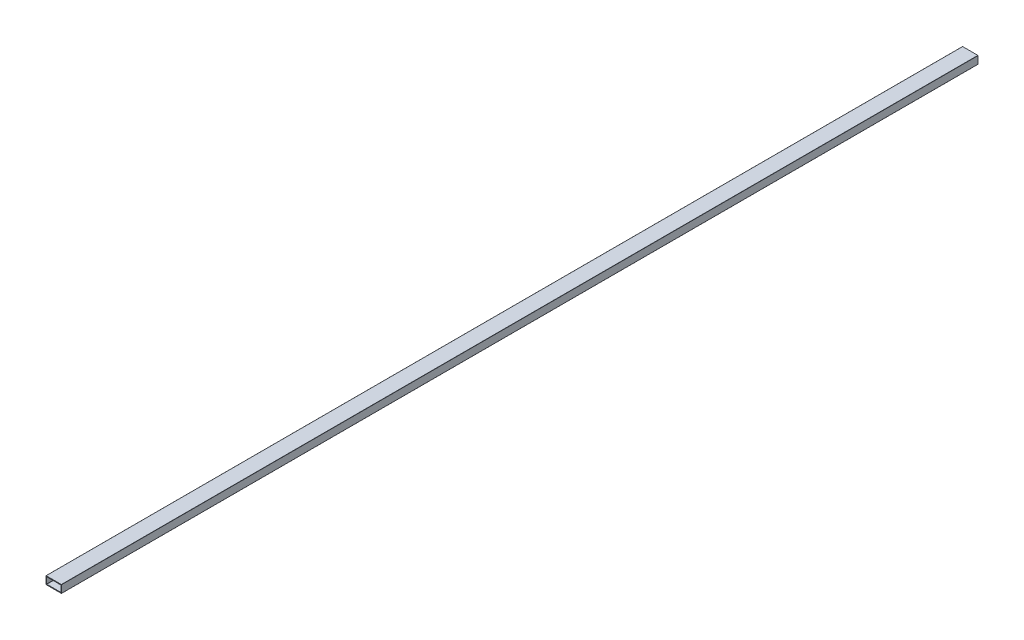
ISO-10303-21;
HEADER;
FILE_DESCRIPTION(('STEP AP214'),'2;1');
FILE_NAME('part.step','',(''),(''),'','','');
FILE_SCHEMA(('AUTOMOTIVE_DESIGN { 1 0 10303 214 1 1 1 1 }'));
ENDSEC;
DATA;
#1=APPLICATION_CONTEXT('core data for automotive mechanical design processes');
#2=APPLICATION_PROTOCOL_DEFINITION('international standard','automotive_design',2000,#1);
#3=PRODUCT_CONTEXT('',#1,'mechanical');
#4=PRODUCT('Part','Part','',(#3));
#5=PRODUCT_RELATED_PRODUCT_CATEGORY('part','',(#4));
#6=PRODUCT_DEFINITION_FORMATION('','',#4);
#7=PRODUCT_DEFINITION_CONTEXT('part definition',#1,'design');
#8=PRODUCT_DEFINITION('design','',#6,#7);
#9=PRODUCT_DEFINITION_SHAPE('','',#8);
#10=(LENGTH_UNIT() NAMED_UNIT(*) SI_UNIT(.MILLI.,.METRE.));
#11=(NAMED_UNIT(*) PLANE_ANGLE_UNIT() SI_UNIT($,.RADIAN.));
#12=(NAMED_UNIT(*) SI_UNIT($,.STERADIAN.) SOLID_ANGLE_UNIT());
#13=UNCERTAINTY_MEASURE_WITH_UNIT(LENGTH_MEASURE(1.E-05),#10,'distance_accuracy_value','');
#14=(GEOMETRIC_REPRESENTATION_CONTEXT(3) GLOBAL_UNCERTAINTY_ASSIGNED_CONTEXT((#13)) GLOBAL_UNIT_ASSIGNED_CONTEXT((#10,
#11,#12)) REPRESENTATION_CONTEXT('',''));
#15=CARTESIAN_POINT('',(0.,0.,0.));
#16=DIRECTION('',(0.,0.,1.));
#17=DIRECTION('',(1.,0.,0.));
#18=AXIS2_PLACEMENT_3D('',#15,#16,#17);
#19=CARTESIAN_POINT('',(50.8,-25.4,-6000.));
#20=DIRECTION('',(1.,0.,0.));
#21=DIRECTION('',(0.,0.,-1.));
#22=AXIS2_PLACEMENT_3D('',#19,#20,#21);
#23=PLANE('',#22);
#24=DIRECTION('',(0.,1.,0.));
#25=VECTOR('',#24,1.);
#26=CARTESIAN_POINT('',(50.8,-25.4,0.));
#27=LINE('',#26,#25);
#28=CARTESIAN_POINT('',(50.8,-24.4,0.));
#29=VERTEX_POINT('',#28);
#30=CARTESIAN_POINT('',(50.8,24.4,0.));
#31=VERTEX_POINT('',#30);
#32=EDGE_CURVE('E197',#29,#31,#27,.T.);
#33=ORIENTED_EDGE('',*,*,#32,.F.);
#34=DIRECTION('',(0.,0.,1.));
#35=VECTOR('',#34,1.);
#36=CARTESIAN_POINT('',(50.8,-24.4,-6000.));
#37=LINE('',#36,#35);
#38=CARTESIAN_POINT('',(50.8,-24.4,-6000.));
#39=VERTEX_POINT('',#38);
#40=EDGE_CURVE('E158',#29,#39,#37,.F.);
#41=ORIENTED_EDGE('',*,*,#40,.T.);
#42=DIRECTION('',(0.,1.,0.));
#43=VECTOR('',#42,1.);
#44=CARTESIAN_POINT('',(50.8,-25.4,-6000.));
#45=LINE('',#44,#43);
#46=CARTESIAN_POINT('',(50.8,24.4,-6000.));
#47=VERTEX_POINT('',#46);
#48=EDGE_CURVE('E185',#39,#47,#45,.T.);
#49=ORIENTED_EDGE('',*,*,#48,.T.);
#50=DIRECTION('',(0.,0.,1.));
#51=VECTOR('',#50,1.);
#52=CARTESIAN_POINT('',(50.8,24.4,-6000.));
#53=LINE('',#52,#51);
#54=EDGE_CURVE('E251',#47,#31,#53,.T.);
#55=ORIENTED_EDGE('',*,*,#54,.T.);
#56=EDGE_LOOP('',(#33,#41,#49,#55));
#57=FACE_BOUND('',#56,.T.);
#58=ADVANCED_FACE('F33',(#57),#23,.T.);
#59=CARTESIAN_POINT('',(-50.8,-25.4,-6000.));
#60=DIRECTION('',(0.,-1.,0.));
#61=DIRECTION('',(0.,0.,-1.));
#62=AXIS2_PLACEMENT_3D('',#59,#60,#61);
#63=PLANE('',#62);
#64=DIRECTION('',(1.,0.,0.));
#65=VECTOR('',#64,1.);
#66=CARTESIAN_POINT('',(-50.8,-25.4,0.));
#67=LINE('',#66,#65);
#68=CARTESIAN_POINT('',(-49.8,-25.4,0.));
#69=VERTEX_POINT('',#68);
#70=CARTESIAN_POINT('',(49.8,-25.4,0.));
#71=VERTEX_POINT('',#70);
#72=EDGE_CURVE('E189',#69,#71,#67,.T.);
#73=ORIENTED_EDGE('',*,*,#72,.F.);
#74=DIRECTION('',(0.,0.,1.));
#75=VECTOR('',#74,1.);
#76=CARTESIAN_POINT('',(-49.8,-25.4,-6000.));
#77=LINE('',#76,#75);
#78=CARTESIAN_POINT('',(-49.8,-25.4,-6000.));
#79=VERTEX_POINT('',#78);
#80=EDGE_CURVE('E238',#69,#79,#77,.F.);
#81=ORIENTED_EDGE('',*,*,#80,.T.);
#82=DIRECTION('',(1.,0.,0.));
#83=VECTOR('',#82,1.);
#84=CARTESIAN_POINT('',(-50.8,-25.4,-6000.));
#85=LINE('',#84,#83);
#86=CARTESIAN_POINT('',(49.8,-25.4,-6000.));
#87=VERTEX_POINT('',#86);
#88=EDGE_CURVE('E194',#79,#87,#85,.T.);
#89=ORIENTED_EDGE('',*,*,#88,.T.);
#90=DIRECTION('',(0.,0.,1.));
#91=VECTOR('',#90,1.);
#92=CARTESIAN_POINT('',(49.8,-25.4,-6000.));
#93=LINE('',#92,#91);
#94=EDGE_CURVE('E235',#87,#71,#93,.T.);
#95=ORIENTED_EDGE('',*,*,#94,.T.);
#96=EDGE_LOOP('',(#73,#81,#89,#95));
#97=FACE_BOUND('',#96,.T.);
#98=ADVANCED_FACE('F305',(#97),#63,.T.);
#99=CARTESIAN_POINT('',(-50.8,-25.4,-6000.));
#100=DIRECTION('',(-1.,0.,0.));
#101=DIRECTION('',(0.,0.,1.));
#102=AXIS2_PLACEMENT_3D('',#99,#100,#101);
#103=PLANE('',#102);
#104=DIRECTION('',(0.,-1.,0.));
#105=VECTOR('',#104,1.);
#106=CARTESIAN_POINT('',(-50.8,-25.4,-6000.));
#107=LINE('',#106,#105);
#108=CARTESIAN_POINT('',(-50.8,24.4,-6000.));
#109=VERTEX_POINT('',#108);
#110=CARTESIAN_POINT('',(-50.8,-24.4,-6000.));
#111=VERTEX_POINT('',#110);
#112=EDGE_CURVE('E191',#109,#111,#107,.T.);
#113=ORIENTED_EDGE('',*,*,#112,.T.);
#114=DIRECTION('',(0.,0.,1.));
#115=VECTOR('',#114,1.);
#116=CARTESIAN_POINT('',(-50.8,-24.4,-6000.));
#117=LINE('',#116,#115);
#118=CARTESIAN_POINT('',(-50.8,-24.4,0.));
#119=VERTEX_POINT('',#118);
#120=EDGE_CURVE('E224',#111,#119,#117,.T.);
#121=ORIENTED_EDGE('',*,*,#120,.T.);
#122=DIRECTION('',(0.,-1.,0.));
#123=VECTOR('',#122,1.);
#124=CARTESIAN_POINT('',(-50.8,-25.4,0.));
#125=LINE('',#124,#123);
#126=CARTESIAN_POINT('',(-50.8,24.4,0.));
#127=VERTEX_POINT('',#126);
#128=EDGE_CURVE('E203',#127,#119,#125,.T.);
#129=ORIENTED_EDGE('',*,*,#128,.F.);
#130=DIRECTION('',(0.,0.,1.));
#131=VECTOR('',#130,1.);
#132=CARTESIAN_POINT('',(-50.8,24.4,-6000.));
#133=LINE('',#132,#131);
#134=EDGE_CURVE('E222',#127,#109,#133,.F.);
#135=ORIENTED_EDGE('',*,*,#134,.T.);
#136=EDGE_LOOP('',(#113,#121,#129,#135));
#137=FACE_BOUND('',#136,.T.);
#138=ADVANCED_FACE('F311',(#137),#103,.T.);
#139=CARTESIAN_POINT('',(-50.8,25.4,-6000.));
#140=DIRECTION('',(0.,1.,0.));
#141=DIRECTION('',(0.,0.,1.));
#142=AXIS2_PLACEMENT_3D('',#139,#140,#141);
#143=PLANE('',#142);
#144=DIRECTION('',(-1.,0.,0.));
#145=VECTOR('',#144,1.);
#146=CARTESIAN_POINT('',(-50.8,25.4,-6000.));
#147=LINE('',#146,#145);
#148=CARTESIAN_POINT('',(49.8,25.4,-6000.));
#149=VERTEX_POINT('',#148);
#150=CARTESIAN_POINT('',(-49.8,25.4,-6000.));
#151=VERTEX_POINT('',#150);
#152=EDGE_CURVE('E188',#149,#151,#147,.T.);
#153=ORIENTED_EDGE('',*,*,#152,.T.);
#154=DIRECTION('',(0.,0.,1.));
#155=VECTOR('',#154,1.);
#156=CARTESIAN_POINT('',(-49.8,25.4,-6000.));
#157=LINE('',#156,#155);
#158=CARTESIAN_POINT('',(-49.8,25.4,0.));
#159=VERTEX_POINT('',#158);
#160=EDGE_CURVE('E248',#151,#159,#157,.T.);
#161=ORIENTED_EDGE('',*,*,#160,.T.);
#162=DIRECTION('',(-1.,0.,0.));
#163=VECTOR('',#162,1.);
#164=CARTESIAN_POINT('',(-50.8,25.4,0.));
#165=LINE('',#164,#163);
#166=CARTESIAN_POINT('',(49.8,25.4,0.));
#167=VERTEX_POINT('',#166);
#168=EDGE_CURVE('E200',#167,#159,#165,.T.);
#169=ORIENTED_EDGE('',*,*,#168,.F.);
#170=DIRECTION('',(0.,0.,1.));
#171=VECTOR('',#170,1.);
#172=CARTESIAN_POINT('',(49.8,25.4,-6000.));
#173=LINE('',#172,#171);
#174=EDGE_CURVE('E55',#167,#149,#173,.F.);
#175=ORIENTED_EDGE('',*,*,#174,.T.);
#176=EDGE_LOOP('',(#153,#161,#169,#175));
#177=FACE_BOUND('',#176,.T.);
#178=ADVANCED_FACE('F316',(#177),#143,.T.);
#179=CARTESIAN_POINT('',(0.,0.,-6000.));
#180=DIRECTION('',(0.,0.,-1.));
#181=DIRECTION('',(-1.,0.,0.));
#182=AXIS2_PLACEMENT_3D('',#179,#180,#181);
#183=PLANE('',#182);
#184=DIRECTION('',(0.,-1.,0.));
#185=VECTOR('',#184,1.);
#186=CARTESIAN_POINT('',(-46.25,-20.85,-6000.));
#187=LINE('',#186,#185);
#188=CARTESIAN_POINT('',(-46.25,19.85,-6000.));
#189=VERTEX_POINT('',#188);
#190=CARTESIAN_POINT('',(-46.25,-19.85,-6000.));
#191=VERTEX_POINT('',#190);
#192=EDGE_CURVE('E167',#189,#191,#187,.T.);
#193=ORIENTED_EDGE('',*,*,#192,.T.);
#194=CARTESIAN_POINT('',(-45.25,-19.85,-6000.));
#195=DIRECTION('',(0.,0.,-1.));
#196=DIRECTION('',(-1.,0.,0.));
#197=AXIS2_PLACEMENT_3D('',#194,#195,#196);
#198=CIRCLE('',#197,1.);
#199=CARTESIAN_POINT('',(-45.25,-20.85,-6000.));
#200=VERTEX_POINT('',#199);
#201=EDGE_CURVE('E11',#191,#200,#198,.F.);
#202=ORIENTED_EDGE('',*,*,#201,.T.);
#203=DIRECTION('',(1.,0.,0.));
#204=VECTOR('',#203,1.);
#205=CARTESIAN_POINT('',(-46.25,-20.85,-6000.));
#206=LINE('',#205,#204);
#207=CARTESIAN_POINT('',(45.25,-20.85,-6000.));
#208=VERTEX_POINT('',#207);
#209=EDGE_CURVE('E175',#200,#208,#206,.T.);
#210=ORIENTED_EDGE('',*,*,#209,.T.);
#211=CARTESIAN_POINT('',(45.25,-19.85,-6000.));
#212=DIRECTION('',(0.,0.,-1.));
#213=DIRECTION('',(-1.,0.,0.));
#214=AXIS2_PLACEMENT_3D('',#211,#212,#213);
#215=CIRCLE('',#214,1.);
#216=CARTESIAN_POINT('',(46.25,-19.85,-6000.));
#217=VERTEX_POINT('',#216);
#218=EDGE_CURVE('E262',#208,#217,#215,.F.);
#219=ORIENTED_EDGE('',*,*,#218,.T.);
#220=DIRECTION('',(0.,1.,0.));
#221=VECTOR('',#220,1.);
#222=CARTESIAN_POINT('',(46.25,-20.85,-6000.));
#223=LINE('',#222,#221);
#224=CARTESIAN_POINT('',(46.25,19.85,-6000.));
#225=VERTEX_POINT('',#224);
#226=EDGE_CURVE('E179',#217,#225,#223,.T.);
#227=ORIENTED_EDGE('',*,*,#226,.T.);
#228=CARTESIAN_POINT('',(45.25,19.85,-6000.));
#229=DIRECTION('',(0.,0.,-1.));
#230=DIRECTION('',(-1.,0.,0.));
#231=AXIS2_PLACEMENT_3D('',#228,#229,#230);
#232=CIRCLE('',#231,1.);
#233=CARTESIAN_POINT('',(45.25,20.85,-6000.));
#234=VERTEX_POINT('',#233);
#235=EDGE_CURVE('E258',#225,#234,#232,.F.);
#236=ORIENTED_EDGE('',*,*,#235,.T.);
#237=DIRECTION('',(-1.,0.,0.));
#238=VECTOR('',#237,1.);
#239=CARTESIAN_POINT('',(-46.25,20.85,-6000.));
#240=LINE('',#239,#238);
#241=CARTESIAN_POINT('',(-45.25,20.85,-6000.));
#242=VERTEX_POINT('',#241);
#243=EDGE_CURVE('E277',#234,#242,#240,.T.);
#244=ORIENTED_EDGE('',*,*,#243,.T.);
#245=CARTESIAN_POINT('',(-45.25,19.85,-6000.));
#246=DIRECTION('',(0.,0.,-1.));
#247=DIRECTION('',(-1.,0.,0.));
#248=AXIS2_PLACEMENT_3D('',#245,#246,#247);
#249=CIRCLE('',#248,1.);
#250=EDGE_CURVE('E157',#242,#189,#249,.F.);
#251=ORIENTED_EDGE('',*,*,#250,.T.);
#252=EDGE_LOOP('',(#193,#202,#210,#219,#227,#236,#244,#251));
#253=FACE_BOUND('',#252,.T.);
#254=ORIENTED_EDGE('',*,*,#88,.F.);
#255=CARTESIAN_POINT('',(-49.8,-24.4,-6000.));
#256=DIRECTION('',(0.,0.,-1.));
#257=DIRECTION('',(-1.,0.,0.));
#258=AXIS2_PLACEMENT_3D('',#255,#256,#257);
#259=CIRCLE('',#258,1.);
#260=EDGE_CURVE('E245',#79,#111,#259,.T.);
#261=ORIENTED_EDGE('',*,*,#260,.T.);
#262=ORIENTED_EDGE('',*,*,#112,.F.);
#263=CARTESIAN_POINT('',(-49.8,24.4,-6000.));
#264=DIRECTION('',(0.,0.,-1.));
#265=DIRECTION('',(-1.,0.,0.));
#266=AXIS2_PLACEMENT_3D('',#263,#264,#265);
#267=CIRCLE('',#266,1.);
#268=EDGE_CURVE('E48',#109,#151,#267,.T.);
#269=ORIENTED_EDGE('',*,*,#268,.T.);
#270=ORIENTED_EDGE('',*,*,#152,.F.);
#271=CARTESIAN_POINT('',(49.8,24.4,-6000.));
#272=DIRECTION('',(0.,0.,-1.));
#273=DIRECTION('',(-1.,0.,0.));
#274=AXIS2_PLACEMENT_3D('',#271,#272,#273);
#275=CIRCLE('',#274,1.);
#276=EDGE_CURVE('E240',#149,#47,#275,.T.);
#277=ORIENTED_EDGE('',*,*,#276,.T.);
#278=ORIENTED_EDGE('',*,*,#48,.F.);
#279=CARTESIAN_POINT('',(49.8,-24.4,-6000.));
#280=DIRECTION('',(0.,0.,-1.));
#281=DIRECTION('',(-1.,0.,0.));
#282=AXIS2_PLACEMENT_3D('',#279,#280,#281);
#283=CIRCLE('',#282,1.);
#284=EDGE_CURVE('E242',#39,#87,#283,.T.);
#285=ORIENTED_EDGE('',*,*,#284,.T.);
#286=EDGE_LOOP('',(#254,#261,#262,#269,#270,#277,#278,#285));
#287=FACE_BOUND('',#286,.T.);
#288=ADVANCED_FACE('F267',(#253,#287),#183,.T.);
#289=CARTESIAN_POINT('',(0.,0.,0.));
#290=DIRECTION('',(0.,0.,-1.));
#291=DIRECTION('',(-1.,0.,0.));
#292=AXIS2_PLACEMENT_3D('',#289,#290,#291);
#293=PLANE('',#292);
#294=DIRECTION('',(0.,1.,0.));
#295=VECTOR('',#294,1.);
#296=CARTESIAN_POINT('',(46.25,-20.85,0.));
#297=LINE('',#296,#295);
#298=CARTESIAN_POINT('',(46.25,-19.85,0.));
#299=VERTEX_POINT('',#298);
#300=CARTESIAN_POINT('',(46.25,19.85,0.));
#301=VERTEX_POINT('',#300);
#302=EDGE_CURVE('E181',#299,#301,#297,.T.);
#303=ORIENTED_EDGE('',*,*,#302,.F.);
#304=CARTESIAN_POINT('',(45.25,-19.85,0.));
#305=DIRECTION('',(0.,0.,-1.));
#306=DIRECTION('',(-1.,0.,0.));
#307=AXIS2_PLACEMENT_3D('',#304,#305,#306);
#308=CIRCLE('',#307,1.);
#309=CARTESIAN_POINT('',(45.25,-20.85,0.));
#310=VERTEX_POINT('',#309);
#311=EDGE_CURVE('E260',#299,#310,#308,.T.);
#312=ORIENTED_EDGE('',*,*,#311,.T.);
#313=DIRECTION('',(1.,0.,0.));
#314=VECTOR('',#313,1.);
#315=CARTESIAN_POINT('',(-46.25,-20.85,0.));
#316=LINE('',#315,#314);
#317=CARTESIAN_POINT('',(-45.25,-20.85,0.));
#318=VERTEX_POINT('',#317);
#319=EDGE_CURVE('E281',#318,#310,#316,.T.);
#320=ORIENTED_EDGE('',*,*,#319,.F.);
#321=CARTESIAN_POINT('',(-45.25,-19.85,0.));
#322=DIRECTION('',(0.,0.,-1.));
#323=DIRECTION('',(-1.,0.,0.));
#324=AXIS2_PLACEMENT_3D('',#321,#322,#323);
#325=CIRCLE('',#324,1.);
#326=CARTESIAN_POINT('',(-46.25,-19.85,0.));
#327=VERTEX_POINT('',#326);
#328=EDGE_CURVE('E41',#318,#327,#325,.T.);
#329=ORIENTED_EDGE('',*,*,#328,.T.);
#330=DIRECTION('',(0.,-1.,0.));
#331=VECTOR('',#330,1.);
#332=CARTESIAN_POINT('',(-46.25,-20.85,0.));
#333=LINE('',#332,#331);
#334=CARTESIAN_POINT('',(-46.25,19.85,0.));
#335=VERTEX_POINT('',#334);
#336=EDGE_CURVE('E164',#335,#327,#333,.T.);
#337=ORIENTED_EDGE('',*,*,#336,.F.);
#338=CARTESIAN_POINT('',(-45.25,19.85,0.));
#339=DIRECTION('',(0.,0.,-1.));
#340=DIRECTION('',(-1.,0.,0.));
#341=AXIS2_PLACEMENT_3D('',#338,#339,#340);
#342=CIRCLE('',#341,1.);
#343=CARTESIAN_POINT('',(-45.25,20.85,0.));
#344=VERTEX_POINT('',#343);
#345=EDGE_CURVE('E147',#335,#344,#342,.T.);
#346=ORIENTED_EDGE('',*,*,#345,.T.);
#347=DIRECTION('',(-1.,0.,0.));
#348=VECTOR('',#347,1.);
#349=CARTESIAN_POINT('',(-46.25,20.85,0.));
#350=LINE('',#349,#348);
#351=CARTESIAN_POINT('',(45.25,20.85,0.));
#352=VERTEX_POINT('',#351);
#353=EDGE_CURVE('E176',#352,#344,#350,.T.);
#354=ORIENTED_EDGE('',*,*,#353,.F.);
#355=CARTESIAN_POINT('',(45.25,19.85,0.));
#356=DIRECTION('',(0.,0.,-1.));
#357=DIRECTION('',(-1.,0.,0.));
#358=AXIS2_PLACEMENT_3D('',#355,#356,#357);
#359=CIRCLE('',#358,1.);
#360=EDGE_CURVE('E256',#352,#301,#359,.T.);
#361=ORIENTED_EDGE('',*,*,#360,.T.);
#362=EDGE_LOOP('',(#303,#312,#320,#329,#337,#346,#354,#361));
#363=FACE_BOUND('',#362,.T.);
#364=ORIENTED_EDGE('',*,*,#128,.T.);
#365=CARTESIAN_POINT('',(-49.8,-24.4,0.));
#366=DIRECTION('',(0.,0.,-1.));
#367=DIRECTION('',(-1.,0.,0.));
#368=AXIS2_PLACEMENT_3D('',#365,#366,#367);
#369=CIRCLE('',#368,1.);
#370=EDGE_CURVE('E233',#119,#69,#369,.F.);
#371=ORIENTED_EDGE('',*,*,#370,.T.);
#372=ORIENTED_EDGE('',*,*,#72,.T.);
#373=CARTESIAN_POINT('',(49.8,-24.4,0.));
#374=DIRECTION('',(0.,0.,-1.));
#375=DIRECTION('',(-1.,0.,0.));
#376=AXIS2_PLACEMENT_3D('',#373,#374,#375);
#377=CIRCLE('',#376,1.);
#378=EDGE_CURVE('E229',#71,#29,#377,.F.);
#379=ORIENTED_EDGE('',*,*,#378,.T.);
#380=ORIENTED_EDGE('',*,*,#32,.T.);
#381=CARTESIAN_POINT('',(49.8,24.4,0.));
#382=DIRECTION('',(0.,0.,-1.));
#383=DIRECTION('',(-1.,0.,0.));
#384=AXIS2_PLACEMENT_3D('',#381,#382,#383);
#385=CIRCLE('',#384,1.);
#386=EDGE_CURVE('E227',#31,#167,#385,.F.);
#387=ORIENTED_EDGE('',*,*,#386,.T.);
#388=ORIENTED_EDGE('',*,*,#168,.T.);
#389=CARTESIAN_POINT('',(-49.8,24.4,0.));
#390=DIRECTION('',(0.,0.,-1.));
#391=DIRECTION('',(-1.,0.,0.));
#392=AXIS2_PLACEMENT_3D('',#389,#390,#391);
#393=CIRCLE('',#392,1.);
#394=EDGE_CURVE('E231',#159,#127,#393,.F.);
#395=ORIENTED_EDGE('',*,*,#394,.T.);
#396=EDGE_LOOP('',(#364,#371,#372,#379,#380,#387,#388,#395));
#397=FACE_BOUND('',#396,.T.);
#398=ADVANCED_FACE('F172',(#363,#397),#293,.F.);
#399=CARTESIAN_POINT('',(-46.25,-20.85,-6000.));
#400=DIRECTION('',(0.,-1.,0.));
#401=DIRECTION('',(0.,0.,-1.));
#402=AXIS2_PLACEMENT_3D('',#399,#400,#401);
#403=PLANE('',#402);
#404=ORIENTED_EDGE('',*,*,#319,.T.);
#405=DIRECTION('',(0.,0.,1.));
#406=VECTOR('',#405,1.);
#407=CARTESIAN_POINT('',(45.25,-20.85,-6000.));
#408=LINE('',#407,#406);
#409=EDGE_CURVE('E220',#310,#208,#408,.F.);
#410=ORIENTED_EDGE('',*,*,#409,.T.);
#411=ORIENTED_EDGE('',*,*,#209,.F.);
#412=DIRECTION('',(0.,0.,1.));
#413=VECTOR('',#412,1.);
#414=CARTESIAN_POINT('',(-45.25,-20.85,0.));
#415=LINE('',#414,#413);
#416=EDGE_CURVE('E217',#200,#318,#415,.T.);
#417=ORIENTED_EDGE('',*,*,#416,.T.);
#418=EDGE_LOOP('',(#404,#410,#411,#417));
#419=FACE_BOUND('',#418,.T.);
#420=ADVANCED_FACE('F283',(#419),#403,.F.);
#421=CARTESIAN_POINT('',(-46.25,-20.85,-6000.));
#422=DIRECTION('',(-1.,0.,0.));
#423=DIRECTION('',(0.,0.,1.));
#424=AXIS2_PLACEMENT_3D('',#421,#422,#423);
#425=PLANE('',#424);
#426=ORIENTED_EDGE('',*,*,#192,.F.);
#427=DIRECTION('',(0.,0.,1.));
#428=VECTOR('',#427,1.);
#429=CARTESIAN_POINT('',(-46.25,19.85,0.));
#430=LINE('',#429,#428);
#431=EDGE_CURVE('E151',#189,#335,#430,.T.);
#432=ORIENTED_EDGE('',*,*,#431,.T.);
#433=ORIENTED_EDGE('',*,*,#336,.T.);
#434=DIRECTION('',(0.,0.,1.));
#435=VECTOR('',#434,1.);
#436=CARTESIAN_POINT('',(-46.25,-19.85,-6000.));
#437=LINE('',#436,#435);
#438=EDGE_CURVE('E169',#327,#191,#437,.F.);
#439=ORIENTED_EDGE('',*,*,#438,.T.);
#440=EDGE_LOOP('',(#426,#432,#433,#439));
#441=FACE_BOUND('',#440,.T.);
#442=ADVANCED_FACE('F163',(#441),#425,.F.);
#443=CARTESIAN_POINT('',(-46.25,20.85,-6000.));
#444=DIRECTION('',(0.,1.,0.));
#445=DIRECTION('',(0.,0.,1.));
#446=AXIS2_PLACEMENT_3D('',#443,#444,#445);
#447=PLANE('',#446);
#448=ORIENTED_EDGE('',*,*,#353,.T.);
#449=DIRECTION('',(0.,0.,1.));
#450=VECTOR('',#449,1.);
#451=CARTESIAN_POINT('',(-45.25,20.85,-6000.));
#452=LINE('',#451,#450);
#453=EDGE_CURVE('E152',#344,#242,#452,.F.);
#454=ORIENTED_EDGE('',*,*,#453,.T.);
#455=ORIENTED_EDGE('',*,*,#243,.F.);
#456=DIRECTION('',(0.,0.,1.));
#457=VECTOR('',#456,1.);
#458=CARTESIAN_POINT('',(45.25,20.85,0.));
#459=LINE('',#458,#457);
#460=EDGE_CURVE('E168',#234,#352,#459,.T.);
#461=ORIENTED_EDGE('',*,*,#460,.T.);
#462=EDGE_LOOP('',(#448,#454,#455,#461));
#463=FACE_BOUND('',#462,.T.);
#464=ADVANCED_FACE('F292',(#463),#447,.F.);
#465=CARTESIAN_POINT('',(46.25,-20.85,-6000.));
#466=DIRECTION('',(1.,0.,0.));
#467=DIRECTION('',(0.,0.,-1.));
#468=AXIS2_PLACEMENT_3D('',#465,#466,#467);
#469=PLANE('',#468);
#470=ORIENTED_EDGE('',*,*,#302,.T.);
#471=DIRECTION('',(0.,0.,1.));
#472=VECTOR('',#471,1.);
#473=CARTESIAN_POINT('',(46.25,19.85,-6000.));
#474=LINE('',#473,#472);
#475=EDGE_CURVE('E215',#301,#225,#474,.F.);
#476=ORIENTED_EDGE('',*,*,#475,.T.);
#477=ORIENTED_EDGE('',*,*,#226,.F.);
#478=DIRECTION('',(0.,0.,1.));
#479=VECTOR('',#478,1.);
#480=CARTESIAN_POINT('',(46.25,-19.85,0.));
#481=LINE('',#480,#479);
#482=EDGE_CURVE('E212',#217,#299,#481,.T.);
#483=ORIENTED_EDGE('',*,*,#482,.T.);
#484=EDGE_LOOP('',(#470,#476,#477,#483));
#485=FACE_BOUND('',#484,.T.);
#486=ADVANCED_FACE('F275',(#485),#469,.F.);
#487=CARTESIAN_POINT('',(-45.25,19.85,-6000.));
#488=DIRECTION('',(0.,0.,-1.));
#489=DIRECTION('',(-1.,0.,0.));
#490=AXIS2_PLACEMENT_3D('',#487,#488,#489);
#491=CYLINDRICAL_SURFACE('',#490,1.);
#492=ORIENTED_EDGE('',*,*,#250,.F.);
#493=ORIENTED_EDGE('',*,*,#453,.F.);
#494=ORIENTED_EDGE('',*,*,#345,.F.);
#495=ORIENTED_EDGE('',*,*,#431,.F.);
#496=EDGE_LOOP('',(#492,#493,#494,#495));
#497=FACE_BOUND('',#496,.T.);
#498=ADVANCED_FACE('F150',(#497),#491,.F.);
#499=CARTESIAN_POINT('',(45.25,19.85,-6000.));
#500=DIRECTION('',(0.,0.,-1.));
#501=DIRECTION('',(-1.,0.,0.));
#502=AXIS2_PLACEMENT_3D('',#499,#500,#501);
#503=CYLINDRICAL_SURFACE('',#502,1.);
#504=ORIENTED_EDGE('',*,*,#235,.F.);
#505=ORIENTED_EDGE('',*,*,#475,.F.);
#506=ORIENTED_EDGE('',*,*,#360,.F.);
#507=ORIENTED_EDGE('',*,*,#460,.F.);
#508=EDGE_LOOP('',(#504,#505,#506,#507));
#509=FACE_BOUND('',#508,.T.);
#510=ADVANCED_FACE('F294',(#509),#503,.F.);
#511=CARTESIAN_POINT('',(45.25,-19.85,-6000.));
#512=DIRECTION('',(0.,0.,-1.));
#513=DIRECTION('',(-1.,0.,0.));
#514=AXIS2_PLACEMENT_3D('',#511,#512,#513);
#515=CYLINDRICAL_SURFACE('',#514,1.);
#516=ORIENTED_EDGE('',*,*,#218,.F.);
#517=ORIENTED_EDGE('',*,*,#409,.F.);
#518=ORIENTED_EDGE('',*,*,#311,.F.);
#519=ORIENTED_EDGE('',*,*,#482,.F.);
#520=EDGE_LOOP('',(#516,#517,#518,#519));
#521=FACE_BOUND('',#520,.T.);
#522=ADVANCED_FACE('F279',(#521),#515,.F.);
#523=CARTESIAN_POINT('',(-49.8,-24.4,-6000.));
#524=DIRECTION('',(0.,0.,1.));
#525=DIRECTION('',(1.,0.,0.));
#526=AXIS2_PLACEMENT_3D('',#523,#524,#525);
#527=CYLINDRICAL_SURFACE('',#526,1.);
#528=ORIENTED_EDGE('',*,*,#260,.F.);
#529=ORIENTED_EDGE('',*,*,#80,.F.);
#530=ORIENTED_EDGE('',*,*,#370,.F.);
#531=ORIENTED_EDGE('',*,*,#120,.F.);
#532=EDGE_LOOP('',(#528,#529,#530,#531));
#533=FACE_BOUND('',#532,.T.);
#534=ADVANCED_FACE('F301',(#533),#527,.T.);
#535=CARTESIAN_POINT('',(-49.8,24.4,-6000.));
#536=DIRECTION('',(0.,0.,1.));
#537=DIRECTION('',(1.,0.,0.));
#538=AXIS2_PLACEMENT_3D('',#535,#536,#537);
#539=CYLINDRICAL_SURFACE('',#538,1.);
#540=ORIENTED_EDGE('',*,*,#268,.F.);
#541=ORIENTED_EDGE('',*,*,#134,.F.);
#542=ORIENTED_EDGE('',*,*,#394,.F.);
#543=ORIENTED_EDGE('',*,*,#160,.F.);
#544=EDGE_LOOP('',(#540,#541,#542,#543));
#545=FACE_BOUND('',#544,.T.);
#546=ADVANCED_FACE('F368',(#545),#539,.T.);
#547=CARTESIAN_POINT('',(-45.25,-19.85,-6000.));
#548=DIRECTION('',(0.,0.,-1.));
#549=DIRECTION('',(-1.,0.,0.));
#550=AXIS2_PLACEMENT_3D('',#547,#548,#549);
#551=CYLINDRICAL_SURFACE('',#550,1.);
#552=ORIENTED_EDGE('',*,*,#201,.F.);
#553=ORIENTED_EDGE('',*,*,#438,.F.);
#554=ORIENTED_EDGE('',*,*,#328,.F.);
#555=ORIENTED_EDGE('',*,*,#416,.F.);
#556=EDGE_LOOP('',(#552,#553,#554,#555));
#557=FACE_BOUND('',#556,.T.);
#558=ADVANCED_FACE('F378',(#557),#551,.F.);
#559=CARTESIAN_POINT('',(49.8,-24.4,-6000.));
#560=DIRECTION('',(0.,0.,1.));
#561=DIRECTION('',(1.,0.,0.));
#562=AXIS2_PLACEMENT_3D('',#559,#560,#561);
#563=CYLINDRICAL_SURFACE('',#562,1.);
#564=ORIENTED_EDGE('',*,*,#284,.F.);
#565=ORIENTED_EDGE('',*,*,#40,.F.);
#566=ORIENTED_EDGE('',*,*,#378,.F.);
#567=ORIENTED_EDGE('',*,*,#94,.F.);
#568=EDGE_LOOP('',(#564,#565,#566,#567));
#569=FACE_BOUND('',#568,.T.);
#570=ADVANCED_FACE('F388',(#569),#563,.T.);
#571=CARTESIAN_POINT('',(49.8,24.4,-6000.));
#572=DIRECTION('',(0.,0.,1.));
#573=DIRECTION('',(1.,0.,0.));
#574=AXIS2_PLACEMENT_3D('',#571,#572,#573);
#575=CYLINDRICAL_SURFACE('',#574,1.);
#576=ORIENTED_EDGE('',*,*,#276,.F.);
#577=ORIENTED_EDGE('',*,*,#174,.F.);
#578=ORIENTED_EDGE('',*,*,#386,.F.);
#579=ORIENTED_EDGE('',*,*,#54,.F.);
#580=EDGE_LOOP('',(#576,#577,#578,#579));
#581=FACE_BOUND('',#580,.T.);
#582=ADVANCED_FACE('F35',(#581),#575,.T.);
#583=CLOSED_SHELL('',(#58,#98,#138,#178,#288,#398,#420,#442,#464,#486,#498,#510,#522,#534,#546,
#558,#570,#582));
#584=MANIFOLD_SOLID_BREP('B2',#583);
#585=ADVANCED_BREP_SHAPE_REPRESENTATION('',(#18,#584),#14);
#586=SHAPE_DEFINITION_REPRESENTATION(#9,#585);
ENDSEC;
END-ISO-10303-21;
